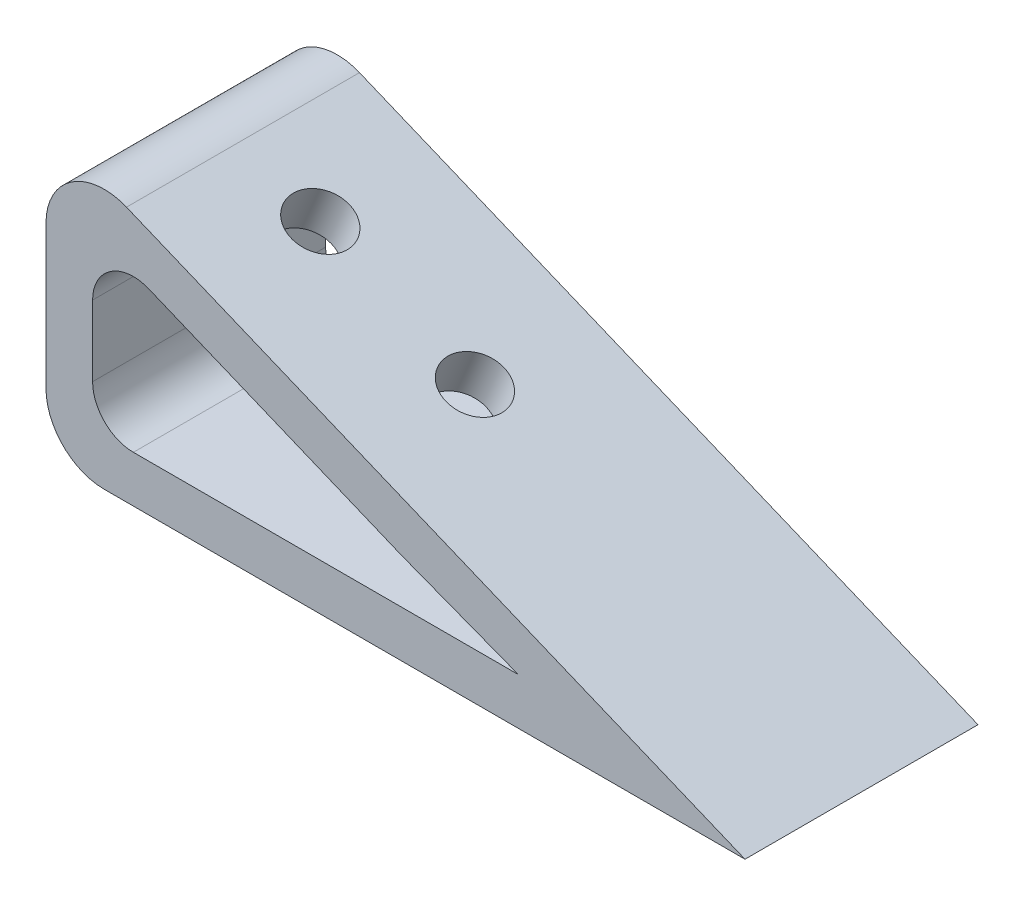
ISO-10303-21;
HEADER;
FILE_DESCRIPTION(('STEP AP214'),'2;1');
FILE_NAME('part.step','',(''),(''),'','','');
FILE_SCHEMA(('AUTOMOTIVE_DESIGN { 1 0 10303 214 1 1 1 1 }'));
ENDSEC;
DATA;
#1=APPLICATION_CONTEXT('core data for automotive mechanical design processes');
#2=APPLICATION_PROTOCOL_DEFINITION('international standard','automotive_design',2000,#1);
#3=PRODUCT_CONTEXT('',#1,'mechanical');
#4=PRODUCT('Part','Part','',(#3));
#5=PRODUCT_RELATED_PRODUCT_CATEGORY('part','',(#4));
#6=PRODUCT_DEFINITION_FORMATION('','',#4);
#7=PRODUCT_DEFINITION_CONTEXT('part definition',#1,'design');
#8=PRODUCT_DEFINITION('design','',#6,#7);
#9=PRODUCT_DEFINITION_SHAPE('','',#8);
#10=(LENGTH_UNIT() NAMED_UNIT(*) SI_UNIT(.MILLI.,.METRE.));
#11=(NAMED_UNIT(*) PLANE_ANGLE_UNIT() SI_UNIT($,.RADIAN.));
#12=(NAMED_UNIT(*) SI_UNIT($,.STERADIAN.) SOLID_ANGLE_UNIT());
#13=UNCERTAINTY_MEASURE_WITH_UNIT(LENGTH_MEASURE(1.E-05),#10,'distance_accuracy_value','');
#14=(GEOMETRIC_REPRESENTATION_CONTEXT(3) GLOBAL_UNCERTAINTY_ASSIGNED_CONTEXT((#13)) GLOBAL_UNIT_ASSIGNED_CONTEXT((#10,
#11,#12)) REPRESENTATION_CONTEXT('',''));
#15=CARTESIAN_POINT('',(0.,0.,0.));
#16=DIRECTION('',(0.,0.,1.));
#17=DIRECTION('',(1.,0.,0.));
#18=AXIS2_PLACEMENT_3D('',#15,#16,#17);
#19=CARTESIAN_POINT('',(46.6188889893319,74.382296993526,10.));
#20=DIRECTION('',(0.,0.,1.));
#21=DIRECTION('',(1.,0.,0.));
#22=AXIS2_PLACEMENT_3D('',#19,#20,#21);
#23=PLANE('',#22);
#24=DIRECTION('',(-0.92427425971439,0.381729083028025,0.));
#25=VECTOR('',#24,1.);
#26=CARTESIAN_POINT('',(101.618888989332,57.076719781537,10.));
#27=LINE('',#26,#25);
#28=CARTESIAN_POINT('',(101.618888989332,57.076719781537,10.));
#29=VERTEX_POINT('',#28);
#30=CARTESIAN_POINT('',(48.527534404472,79.003668292098,10.));
#31=VERTEX_POINT('',#30);
#32=EDGE_CURVE('E173',#29,#31,#27,.T.);
#33=ORIENTED_EDGE('',*,*,#32,.T.);
#34=CARTESIAN_POINT('',(46.6188889893319,74.382296993526,10.));
#35=DIRECTION('',(0.,0.,1.));
#36=DIRECTION('',(1.,0.,0.));
#37=AXIS2_PLACEMENT_3D('',#34,#35,#36);
#38=CIRCLE('',#37,5.00000000000001);
#39=CARTESIAN_POINT('',(41.6188889893319,74.382296993526,10.));
#40=VERTEX_POINT('',#39);
#41=EDGE_CURVE('E176',#31,#40,#38,.T.);
#42=ORIENTED_EDGE('',*,*,#41,.T.);
#43=DIRECTION('',(0.,-1.,0.));
#44=VECTOR('',#43,1.);
#45=CARTESIAN_POINT('',(41.6188889893319,74.382296993526,10.));
#46=LINE('',#45,#44);
#47=CARTESIAN_POINT('',(41.6188889893319,62.076719781537,10.));
#48=VERTEX_POINT('',#47);
#49=EDGE_CURVE('E179',#40,#48,#46,.T.);
#50=ORIENTED_EDGE('',*,*,#49,.T.);
#51=CARTESIAN_POINT('',(46.6188889893319,62.076719781537,10.));
#52=DIRECTION('',(0.,0.,1.));
#53=DIRECTION('',(-1.,0.,0.));
#54=AXIS2_PLACEMENT_3D('',#51,#52,#53);
#55=CIRCLE('',#54,5.);
#56=CARTESIAN_POINT('',(46.6188889893319,57.076719781537,10.));
#57=VERTEX_POINT('',#56);
#58=EDGE_CURVE('E181',#48,#57,#55,.T.);
#59=ORIENTED_EDGE('',*,*,#58,.T.);
#60=DIRECTION('',(1.,0.,0.));
#61=VECTOR('',#60,1.);
#62=CARTESIAN_POINT('',(46.6188889893319,57.076719781537,10.));
#63=LINE('',#62,#61);
#64=EDGE_CURVE('E183',#57,#29,#63,.T.);
#65=ORIENTED_EDGE('',*,*,#64,.T.);
#66=EDGE_LOOP('',(#33,#42,#50,#59,#65));
#67=FACE_BOUND('',#66,.T.);
#68=DIRECTION('',(-0.92427425971439,0.381729083028025,0.));
#69=VECTOR('',#68,1.);
#70=CARTESIAN_POINT('',(72.136693702154,64.9252683009658,10.));
#71=LINE('',#70,#69);
#72=CARTESIAN_POINT('',(72.136693702154,64.9252683009658,10.));
#73=VERTEX_POINT('',#72);
#74=CARTESIAN_POINT('',(50.45494077993,73.8799217216922,10.));
#75=VERTEX_POINT('',#74);
#76=EDGE_CURVE('E129',#73,#75,#71,.T.);
#77=ORIENTED_EDGE('',*,*,#76,.F.);
#78=DIRECTION('',(-0.933658248678481,0.358165150000151,0.));
#79=VECTOR('',#78,1.);
#80=CARTESIAN_POINT('',(72.136693702154,64.9252683009658,10.));
#81=LINE('',#80,#79);
#82=CARTESIAN_POINT('',(82.1690183730567,61.076719781537,10.));
#83=VERTEX_POINT('',#82);
#84=EDGE_CURVE('E121',#83,#73,#81,.T.);
#85=ORIENTED_EDGE('',*,*,#84,.F.);
#86=DIRECTION('',(1.,0.,0.));
#87=VECTOR('',#86,1.);
#88=CARTESIAN_POINT('',(49.1188889893319,61.076719781537,10.));
#89=LINE('',#88,#87);
#90=CARTESIAN_POINT('',(49.1188889893319,61.076719781537,10.));
#91=VERTEX_POINT('',#90);
#92=EDGE_CURVE('E151',#91,#83,#89,.T.);
#93=ORIENTED_EDGE('',*,*,#92,.F.);
#94=CARTESIAN_POINT('',(49.1188889893319,64.576719781537,10.));
#95=DIRECTION('',(0.,0.,1.));
#96=DIRECTION('',(-1.,0.,0.));
#97=AXIS2_PLACEMENT_3D('',#94,#95,#96);
#98=CIRCLE('',#97,3.5);
#99=CARTESIAN_POINT('',(45.6188889893319,64.576719781537,10.));
#100=VERTEX_POINT('',#99);
#101=EDGE_CURVE('E149',#100,#91,#98,.T.);
#102=ORIENTED_EDGE('',*,*,#101,.F.);
#103=DIRECTION('',(0.,-1.,0.));
#104=VECTOR('',#103,1.);
#105=CARTESIAN_POINT('',(45.6188889893319,70.6449618126918,10.));
#106=LINE('',#105,#104);
#107=CARTESIAN_POINT('',(45.6188889893319,70.6449618126918,10.));
#108=VERTEX_POINT('',#107);
#109=EDGE_CURVE('E144',#108,#100,#106,.T.);
#110=ORIENTED_EDGE('',*,*,#109,.F.);
#111=CARTESIAN_POINT('',(49.1188889893319,70.6449618126918,10.));
#112=DIRECTION('',(0.,0.,1.));
#113=DIRECTION('',(1.,0.,0.));
#114=AXIS2_PLACEMENT_3D('',#111,#112,#113);
#115=CIRCLE('',#114,3.5);
#116=EDGE_CURVE('E142',#75,#108,#115,.T.);
#117=ORIENTED_EDGE('',*,*,#116,.F.);
#118=EDGE_LOOP('',(#77,#85,#93,#102,#110,#117));
#119=FACE_BOUND('',#118,.T.);
#120=ADVANCED_FACE('F36',(#67,#119),#23,.T.);
#121=CARTESIAN_POINT('',(46.6188889893319,74.382296993526,-10.));
#122=DIRECTION('',(0.,0.,1.));
#123=DIRECTION('',(1.,0.,0.));
#124=AXIS2_PLACEMENT_3D('',#121,#122,#123);
#125=PLANE('',#124);
#126=DIRECTION('',(-0.92427425971439,0.381729083028025,0.));
#127=VECTOR('',#126,1.);
#128=CARTESIAN_POINT('',(101.618888989332,57.076719781537,-10.));
#129=LINE('',#128,#127);
#130=CARTESIAN_POINT('',(101.618888989332,57.076719781537,-10.));
#131=VERTEX_POINT('',#130);
#132=CARTESIAN_POINT('',(48.527534404472,79.003668292098,-10.));
#133=VERTEX_POINT('',#132);
#134=EDGE_CURVE('E137',#131,#133,#129,.T.);
#135=ORIENTED_EDGE('',*,*,#134,.F.);
#136=DIRECTION('',(1.,0.,0.));
#137=VECTOR('',#136,1.);
#138=CARTESIAN_POINT('',(46.6188889893319,57.076719781537,-10.));
#139=LINE('',#138,#137);
#140=CARTESIAN_POINT('',(46.6188889893319,57.076719781537,-10.));
#141=VERTEX_POINT('',#140);
#142=EDGE_CURVE('E177',#141,#131,#139,.T.);
#143=ORIENTED_EDGE('',*,*,#142,.F.);
#144=CARTESIAN_POINT('',(46.6188889893319,62.076719781537,-10.));
#145=DIRECTION('',(0.,0.,1.));
#146=DIRECTION('',(-1.,0.,0.));
#147=AXIS2_PLACEMENT_3D('',#144,#145,#146);
#148=CIRCLE('',#147,5.);
#149=CARTESIAN_POINT('',(41.6188889893319,62.076719781537,-10.));
#150=VERTEX_POINT('',#149);
#151=EDGE_CURVE('E192',#150,#141,#148,.T.);
#152=ORIENTED_EDGE('',*,*,#151,.F.);
#153=DIRECTION('',(0.,-1.,0.));
#154=VECTOR('',#153,1.);
#155=CARTESIAN_POINT('',(41.6188889893319,74.382296993526,-10.));
#156=LINE('',#155,#154);
#157=CARTESIAN_POINT('',(41.6188889893319,74.382296993526,-10.));
#158=VERTEX_POINT('',#157);
#159=EDGE_CURVE('E190',#158,#150,#156,.T.);
#160=ORIENTED_EDGE('',*,*,#159,.F.);
#161=CARTESIAN_POINT('',(46.6188889893319,74.382296993526,-10.));
#162=DIRECTION('',(0.,0.,1.));
#163=DIRECTION('',(1.,0.,0.));
#164=AXIS2_PLACEMENT_3D('',#161,#162,#163);
#165=CIRCLE('',#164,5.00000000000001);
#166=EDGE_CURVE('E188',#133,#158,#165,.T.);
#167=ORIENTED_EDGE('',*,*,#166,.F.);
#168=EDGE_LOOP('',(#135,#143,#152,#160,#167));
#169=FACE_BOUND('',#168,.T.);
#170=DIRECTION('',(-0.933658248678481,0.358165150000151,0.));
#171=VECTOR('',#170,1.);
#172=CARTESIAN_POINT('',(72.136693702154,64.9252683009658,-10.));
#173=LINE('',#172,#171);
#174=CARTESIAN_POINT('',(82.1690183730567,61.076719781537,-10.));
#175=VERTEX_POINT('',#174);
#176=CARTESIAN_POINT('',(72.136693702154,64.9252683009658,-10.));
#177=VERTEX_POINT('',#176);
#178=EDGE_CURVE('E61',#175,#177,#173,.T.);
#179=ORIENTED_EDGE('',*,*,#178,.T.);
#180=DIRECTION('',(-0.92427425971439,0.381729083028025,0.));
#181=VECTOR('',#180,1.);
#182=CARTESIAN_POINT('',(72.136693702154,64.9252683009658,-10.));
#183=LINE('',#182,#181);
#184=CARTESIAN_POINT('',(50.45494077993,73.8799217216922,-10.));
#185=VERTEX_POINT('',#184);
#186=EDGE_CURVE('E136',#177,#185,#183,.T.);
#187=ORIENTED_EDGE('',*,*,#186,.T.);
#188=CARTESIAN_POINT('',(49.1188889893319,70.6449618126918,-10.));
#189=DIRECTION('',(0.,0.,1.));
#190=DIRECTION('',(1.,0.,0.));
#191=AXIS2_PLACEMENT_3D('',#188,#189,#190);
#192=CIRCLE('',#191,3.5);
#193=CARTESIAN_POINT('',(45.6188889893319,70.6449618126918,-10.));
#194=VERTEX_POINT('',#193);
#195=EDGE_CURVE('E155',#185,#194,#192,.T.);
#196=ORIENTED_EDGE('',*,*,#195,.T.);
#197=DIRECTION('',(0.,-1.,0.));
#198=VECTOR('',#197,1.);
#199=CARTESIAN_POINT('',(45.6188889893319,70.6449618126918,-10.));
#200=LINE('',#199,#198);
#201=CARTESIAN_POINT('',(45.6188889893319,64.576719781537,-10.));
#202=VERTEX_POINT('',#201);
#203=EDGE_CURVE('E158',#194,#202,#200,.T.);
#204=ORIENTED_EDGE('',*,*,#203,.T.);
#205=CARTESIAN_POINT('',(49.1188889893319,64.576719781537,-10.));
#206=DIRECTION('',(0.,0.,1.));
#207=DIRECTION('',(-1.,0.,0.));
#208=AXIS2_PLACEMENT_3D('',#205,#206,#207);
#209=CIRCLE('',#208,3.5);
#210=CARTESIAN_POINT('',(49.1188889893319,61.076719781537,-10.));
#211=VERTEX_POINT('',#210);
#212=EDGE_CURVE('E161',#202,#211,#209,.T.);
#213=ORIENTED_EDGE('',*,*,#212,.T.);
#214=DIRECTION('',(1.,0.,0.));
#215=VECTOR('',#214,1.);
#216=CARTESIAN_POINT('',(71.3732355360979,61.076719781537,-10.));
#217=LINE('',#216,#215);
#218=EDGE_CURVE('E130',#211,#175,#217,.T.);
#219=ORIENTED_EDGE('',*,*,#218,.T.);
#220=EDGE_LOOP('',(#179,#187,#196,#204,#213,#219));
#221=FACE_BOUND('',#220,.T.);
#222=ADVANCED_FACE('F223',(#169,#221),#125,.F.);
#223=CARTESIAN_POINT('',(101.618888989332,57.076719781537,10.));
#224=DIRECTION('',(-0.381729083028025,-0.92427425971439,0.));
#225=DIRECTION('',(0.92427425971439,-0.381729083028025,0.));
#226=AXIS2_PLACEMENT_3D('',#223,#224,#225);
#227=PLANE('',#226);
#228=CARTESIAN_POINT('',(55.1640838659377,76.262745980599,0.));
#229=DIRECTION('',(0.381729083028025,0.92427425971439,0.));
#230=DIRECTION('',(-0.92427425971439,0.381729083028025,0.));
#231=AXIS2_PLACEMENT_3D('',#228,#229,#230);
#232=CIRCLE('',#231,2.50000000000001);
#233=CARTESIAN_POINT('',(52.8533982166517,77.2170686881691,0.));
#234=VERTEX_POINT('',#233);
#235=EDGE_CURVE('E206',#234,#234,#232,.T.);
#236=ORIENTED_EDGE('',*,*,#235,.F.);
#237=EDGE_LOOP('',(#236));
#238=FACE_BOUND('',#237,.T.);
#239=CARTESIAN_POINT('',(68.4369225121526,70.7810088529587,0.));
#240=DIRECTION('',(0.381729083028025,0.92427425971439,0.));
#241=DIRECTION('',(-0.92427425971439,0.381729083028025,0.));
#242=AXIS2_PLACEMENT_3D('',#239,#240,#241);
#243=CIRCLE('',#242,2.50000000000001);
#244=CARTESIAN_POINT('',(66.1262368628666,71.7353315605288,0.));
#245=VERTEX_POINT('',#244);
#246=EDGE_CURVE('E211',#245,#245,#243,.T.);
#247=ORIENTED_EDGE('',*,*,#246,.F.);
#248=EDGE_LOOP('',(#247));
#249=FACE_BOUND('',#248,.T.);
#250=ORIENTED_EDGE('',*,*,#134,.T.);
#251=DIRECTION('',(0.,0.,-1.));
#252=VECTOR('',#251,1.);
#253=CARTESIAN_POINT('',(48.527534404472,79.003668292098,10.));
#254=LINE('',#253,#252);
#255=EDGE_CURVE('E11',#31,#133,#254,.T.);
#256=ORIENTED_EDGE('',*,*,#255,.F.);
#257=ORIENTED_EDGE('',*,*,#32,.F.);
#258=DIRECTION('',(0.,0.,-1.));
#259=VECTOR('',#258,1.);
#260=CARTESIAN_POINT('',(101.618888989332,57.076719781537,10.));
#261=LINE('',#260,#259);
#262=EDGE_CURVE('E185',#29,#131,#261,.T.);
#263=ORIENTED_EDGE('',*,*,#262,.T.);
#264=EDGE_LOOP('',(#250,#256,#257,#263));
#265=FACE_BOUND('',#264,.T.);
#266=ADVANCED_FACE('F38',(#238,#249,#265),#227,.F.);
#267=CARTESIAN_POINT('',(46.6188889893319,74.382296993526,10.));
#268=DIRECTION('',(0.,0.,-1.));
#269=DIRECTION('',(-1.,0.,0.));
#270=AXIS2_PLACEMENT_3D('',#267,#268,#269);
#271=CYLINDRICAL_SURFACE('',#270,5.00000000000001);
#272=ORIENTED_EDGE('',*,*,#166,.T.);
#273=DIRECTION('',(0.,0.,-1.));
#274=VECTOR('',#273,1.);
#275=CARTESIAN_POINT('',(41.6188889893319,74.382296993526,10.));
#276=LINE('',#275,#274);
#277=EDGE_CURVE('E45',#40,#158,#276,.T.);
#278=ORIENTED_EDGE('',*,*,#277,.F.);
#279=ORIENTED_EDGE('',*,*,#41,.F.);
#280=ORIENTED_EDGE('',*,*,#255,.T.);
#281=EDGE_LOOP('',(#272,#278,#279,#280));
#282=FACE_BOUND('',#281,.T.);
#283=ADVANCED_FACE('F222',(#282),#271,.T.);
#284=CARTESIAN_POINT('',(41.6188889893319,74.382296993526,10.));
#285=DIRECTION('',(1.,0.,0.));
#286=DIRECTION('',(0.,1.,0.));
#287=AXIS2_PLACEMENT_3D('',#284,#285,#286);
#288=PLANE('',#287);
#289=ORIENTED_EDGE('',*,*,#159,.T.);
#290=DIRECTION('',(0.,0.,-1.));
#291=VECTOR('',#290,1.);
#292=CARTESIAN_POINT('',(41.6188889893319,62.076719781537,10.));
#293=LINE('',#292,#291);
#294=EDGE_CURVE('E200',#48,#150,#293,.T.);
#295=ORIENTED_EDGE('',*,*,#294,.F.);
#296=ORIENTED_EDGE('',*,*,#49,.F.);
#297=ORIENTED_EDGE('',*,*,#277,.T.);
#298=EDGE_LOOP('',(#289,#295,#296,#297));
#299=FACE_BOUND('',#298,.T.);
#300=ADVANCED_FACE('F247',(#299),#288,.F.);
#301=CARTESIAN_POINT('',(46.6188889893319,62.076719781537,10.));
#302=DIRECTION('',(0.,0.,-1.));
#303=DIRECTION('',(-1.,0.,0.));
#304=AXIS2_PLACEMENT_3D('',#301,#302,#303);
#305=CYLINDRICAL_SURFACE('',#304,5.);
#306=ORIENTED_EDGE('',*,*,#151,.T.);
#307=DIRECTION('',(0.,0.,-1.));
#308=VECTOR('',#307,1.);
#309=CARTESIAN_POINT('',(46.6188889893319,57.076719781537,10.));
#310=LINE('',#309,#308);
#311=EDGE_CURVE('E197',#57,#141,#310,.T.);
#312=ORIENTED_EDGE('',*,*,#311,.F.);
#313=ORIENTED_EDGE('',*,*,#58,.F.);
#314=ORIENTED_EDGE('',*,*,#294,.T.);
#315=EDGE_LOOP('',(#306,#312,#313,#314));
#316=FACE_BOUND('',#315,.T.);
#317=ADVANCED_FACE('F244',(#316),#305,.T.);
#318=CARTESIAN_POINT('',(46.6188889893319,57.076719781537,10.));
#319=DIRECTION('',(0.,1.,0.));
#320=DIRECTION('',(0.,0.,1.));
#321=AXIS2_PLACEMENT_3D('',#318,#319,#320);
#322=PLANE('',#321);
#323=ORIENTED_EDGE('',*,*,#142,.T.);
#324=ORIENTED_EDGE('',*,*,#262,.F.);
#325=ORIENTED_EDGE('',*,*,#64,.F.);
#326=ORIENTED_EDGE('',*,*,#311,.T.);
#327=EDGE_LOOP('',(#323,#324,#325,#326));
#328=FACE_BOUND('',#327,.T.);
#329=ADVANCED_FACE('F242',(#328),#322,.F.);
#330=CARTESIAN_POINT('',(72.136693702154,64.9252683009658,10.));
#331=DIRECTION('',(-0.358165150000151,-0.933658248678481,0.));
#332=DIRECTION('',(0.933658248678482,-0.358165150000151,0.));
#333=AXIS2_PLACEMENT_3D('',#330,#331,#332);
#334=PLANE('',#333);
#335=ORIENTED_EDGE('',*,*,#178,.F.);
#336=DIRECTION('',(0.,0.,-1.));
#337=VECTOR('',#336,1.);
#338=CARTESIAN_POINT('',(82.1690183730567,61.076719781537,10.));
#339=LINE('',#338,#337);
#340=EDGE_CURVE('E125',#83,#175,#339,.T.);
#341=ORIENTED_EDGE('',*,*,#340,.F.);
#342=ORIENTED_EDGE('',*,*,#84,.T.);
#343=DIRECTION('',(0.,0.,-1.));
#344=VECTOR('',#343,1.);
#345=CARTESIAN_POINT('',(72.136693702154,64.9252683009658,10.));
#346=LINE('',#345,#344);
#347=EDGE_CURVE('E124',#73,#177,#346,.T.);
#348=ORIENTED_EDGE('',*,*,#347,.T.);
#349=EDGE_LOOP('',(#335,#341,#342,#348));
#350=FACE_BOUND('',#349,.T.);
#351=ADVANCED_FACE('F123',(#350),#334,.T.);
#352=CARTESIAN_POINT('',(72.136693702154,64.9252683009658,10.));
#353=DIRECTION('',(-0.381729083028025,-0.92427425971439,0.));
#354=DIRECTION('',(0.92427425971439,-0.381729083028025,0.));
#355=AXIS2_PLACEMENT_3D('',#352,#353,#354);
#356=PLANE('',#355);
#357=CARTESIAN_POINT('',(53.6371675338255,72.5656489417414,0.));
#358=DIRECTION('',(-0.381729083028025,-0.92427425971439,0.));
#359=DIRECTION('',(0.92427425971439,-0.381729083028025,0.));
#360=AXIS2_PLACEMENT_3D('',#357,#358,#359);
#361=CIRCLE('',#360,2.50000000000001);
#362=CARTESIAN_POINT('',(55.9478531831115,71.6113262341713,0.));
#363=VERTEX_POINT('',#362);
#364=EDGE_CURVE('E40',#363,#363,#361,.T.);
#365=ORIENTED_EDGE('',*,*,#364,.F.);
#366=EDGE_LOOP('',(#365));
#367=FACE_BOUND('',#366,.T.);
#368=CARTESIAN_POINT('',(66.9100061800405,67.0839118141011,0.));
#369=DIRECTION('',(-0.381729083028025,-0.92427425971439,0.));
#370=DIRECTION('',(0.92427425971439,-0.381729083028025,0.));
#371=AXIS2_PLACEMENT_3D('',#368,#369,#370);
#372=CIRCLE('',#371,2.50000000000001);
#373=CARTESIAN_POINT('',(69.2206918293265,66.1295891065311,0.));
#374=VERTEX_POINT('',#373);
#375=EDGE_CURVE('E204',#374,#374,#372,.T.);
#376=ORIENTED_EDGE('',*,*,#375,.F.);
#377=EDGE_LOOP('',(#376));
#378=FACE_BOUND('',#377,.T.);
#379=ORIENTED_EDGE('',*,*,#186,.F.);
#380=ORIENTED_EDGE('',*,*,#347,.F.);
#381=ORIENTED_EDGE('',*,*,#76,.T.);
#382=DIRECTION('',(0.,0.,-1.));
#383=VECTOR('',#382,1.);
#384=CARTESIAN_POINT('',(50.45494077993,73.8799217216922,10.));
#385=LINE('',#384,#383);
#386=EDGE_CURVE('E138',#75,#185,#385,.T.);
#387=ORIENTED_EDGE('',*,*,#386,.T.);
#388=EDGE_LOOP('',(#379,#380,#381,#387));
#389=FACE_BOUND('',#388,.T.);
#390=ADVANCED_FACE('F133',(#367,#378,#389),#356,.T.);
#391=CARTESIAN_POINT('',(49.1188889893319,70.6449618126918,10.));
#392=DIRECTION('',(0.,0.,-1.));
#393=DIRECTION('',(-1.,0.,0.));
#394=AXIS2_PLACEMENT_3D('',#391,#392,#393);
#395=CYLINDRICAL_SURFACE('',#394,3.5);
#396=ORIENTED_EDGE('',*,*,#195,.F.);
#397=ORIENTED_EDGE('',*,*,#386,.F.);
#398=ORIENTED_EDGE('',*,*,#116,.T.);
#399=DIRECTION('',(0.,0.,-1.));
#400=VECTOR('',#399,1.);
#401=CARTESIAN_POINT('',(45.6188889893319,70.6449618126918,10.));
#402=LINE('',#401,#400);
#403=EDGE_CURVE('E170',#108,#194,#402,.T.);
#404=ORIENTED_EDGE('',*,*,#403,.T.);
#405=EDGE_LOOP('',(#396,#397,#398,#404));
#406=FACE_BOUND('',#405,.T.);
#407=ADVANCED_FACE('F271',(#406),#395,.F.);
#408=CARTESIAN_POINT('',(45.6188889893319,70.6449618126918,10.));
#409=DIRECTION('',(1.,0.,0.));
#410=DIRECTION('',(0.,0.,-1.));
#411=AXIS2_PLACEMENT_3D('',#408,#409,#410);
#412=PLANE('',#411);
#413=ORIENTED_EDGE('',*,*,#203,.F.);
#414=ORIENTED_EDGE('',*,*,#403,.F.);
#415=ORIENTED_EDGE('',*,*,#109,.T.);
#416=DIRECTION('',(0.,0.,-1.));
#417=VECTOR('',#416,1.);
#418=CARTESIAN_POINT('',(45.6188889893319,64.576719781537,10.));
#419=LINE('',#418,#417);
#420=EDGE_CURVE('E168',#100,#202,#419,.T.);
#421=ORIENTED_EDGE('',*,*,#420,.T.);
#422=EDGE_LOOP('',(#413,#414,#415,#421));
#423=FACE_BOUND('',#422,.T.);
#424=ADVANCED_FACE('F276',(#423),#412,.T.);
#425=CARTESIAN_POINT('',(49.1188889893319,64.576719781537,10.));
#426=DIRECTION('',(0.,0.,-1.));
#427=DIRECTION('',(-1.,0.,0.));
#428=AXIS2_PLACEMENT_3D('',#425,#426,#427);
#429=CYLINDRICAL_SURFACE('',#428,3.5);
#430=ORIENTED_EDGE('',*,*,#212,.F.);
#431=ORIENTED_EDGE('',*,*,#420,.F.);
#432=ORIENTED_EDGE('',*,*,#101,.T.);
#433=DIRECTION('',(0.,0.,-1.));
#434=VECTOR('',#433,1.);
#435=CARTESIAN_POINT('',(49.1188889893319,61.076719781537,10.));
#436=LINE('',#435,#434);
#437=EDGE_CURVE('E53',#91,#211,#436,.T.);
#438=ORIENTED_EDGE('',*,*,#437,.T.);
#439=EDGE_LOOP('',(#430,#431,#432,#438));
#440=FACE_BOUND('',#439,.T.);
#441=ADVANCED_FACE('F284',(#440),#429,.F.);
#442=CARTESIAN_POINT('',(71.3732355360979,61.076719781537,10.));
#443=DIRECTION('',(0.,1.,0.));
#444=DIRECTION('',(0.,0.,1.));
#445=AXIS2_PLACEMENT_3D('',#442,#443,#444);
#446=PLANE('',#445);
#447=ORIENTED_EDGE('',*,*,#218,.F.);
#448=ORIENTED_EDGE('',*,*,#437,.F.);
#449=ORIENTED_EDGE('',*,*,#92,.T.);
#450=ORIENTED_EDGE('',*,*,#340,.T.);
#451=EDGE_LOOP('',(#447,#448,#449,#450));
#452=FACE_BOUND('',#451,.T.);
#453=ADVANCED_FACE('F288',(#452),#446,.T.);
#454=CARTESIAN_POINT('',(65.3830898479284,63.3868147752436,0.));
#455=DIRECTION('',(0.381729083028025,0.92427425971439,0.));
#456=DIRECTION('',(-0.92427425971439,0.381729083028025,0.));
#457=AXIS2_PLACEMENT_3D('',#454,#455,#456);
#458=CYLINDRICAL_SURFACE('',#457,2.50000000000001);
#459=ORIENTED_EDGE('',*,*,#375,.T.);
#460=EDGE_LOOP('',(#459));
#461=FACE_BOUND('',#460,.T.);
#462=ORIENTED_EDGE('',*,*,#246,.T.);
#463=EDGE_LOOP('',(#462));
#464=FACE_BOUND('',#463,.T.);
#465=ADVANCED_FACE('F218',(#461,#464),#458,.F.);
#466=CARTESIAN_POINT('',(52.1102512017135,68.8685519028839,0.));
#467=DIRECTION('',(0.381729083028025,0.92427425971439,0.));
#468=DIRECTION('',(-0.92427425971439,0.381729083028025,0.));
#469=AXIS2_PLACEMENT_3D('',#466,#467,#468);
#470=CYLINDRICAL_SURFACE('',#469,2.50000000000001);
#471=ORIENTED_EDGE('',*,*,#364,.T.);
#472=EDGE_LOOP('',(#471));
#473=FACE_BOUND('',#472,.T.);
#474=ORIENTED_EDGE('',*,*,#235,.T.);
#475=EDGE_LOOP('',(#474));
#476=FACE_BOUND('',#475,.T.);
#477=ADVANCED_FACE('F294',(#473,#476),#470,.F.);
#478=CLOSED_SHELL('',(#120,#222,#266,#283,#300,#317,#329,#351,#390,#407,#424,#441,#453,#465,#477));
#479=MANIFOLD_SOLID_BREP('B2',#478);
#480=ADVANCED_BREP_SHAPE_REPRESENTATION('',(#18,#479),#14);
#481=SHAPE_DEFINITION_REPRESENTATION(#9,#480);
ENDSEC;
END-ISO-10303-21;
